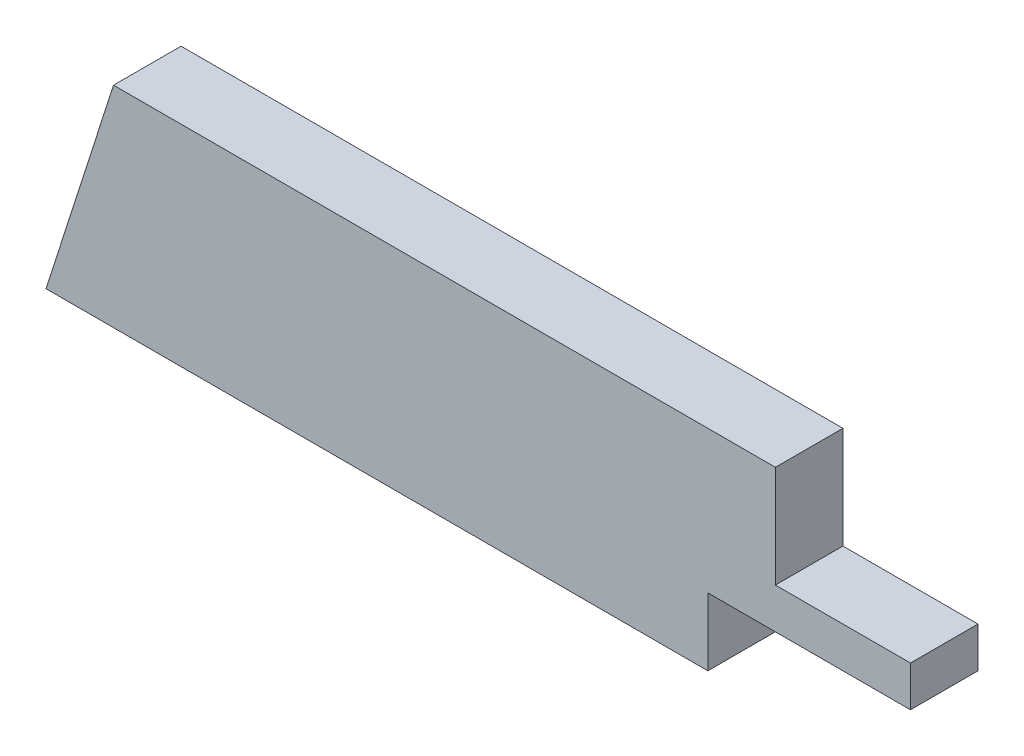
ISO-10303-21;
HEADER;
FILE_DESCRIPTION(('STEP AP214'),'2;1');
FILE_NAME('part.step','',(''),(''),'','','');
FILE_SCHEMA(('AUTOMOTIVE_DESIGN { 1 0 10303 214 1 1 1 1 }'));
ENDSEC;
DATA;
#1=APPLICATION_CONTEXT('core data for automotive mechanical design processes');
#2=APPLICATION_PROTOCOL_DEFINITION('international standard','automotive_design',2000,#1);
#3=PRODUCT_CONTEXT('',#1,'mechanical');
#4=PRODUCT('Part','Part','',(#3));
#5=PRODUCT_RELATED_PRODUCT_CATEGORY('part','',(#4));
#6=PRODUCT_DEFINITION_FORMATION('','',#4);
#7=PRODUCT_DEFINITION_CONTEXT('part definition',#1,'design');
#8=PRODUCT_DEFINITION('design','',#6,#7);
#9=PRODUCT_DEFINITION_SHAPE('','',#8);
#10=(LENGTH_UNIT() NAMED_UNIT(*) SI_UNIT(.MILLI.,.METRE.));
#11=(NAMED_UNIT(*) PLANE_ANGLE_UNIT() SI_UNIT($,.RADIAN.));
#12=(NAMED_UNIT(*) SI_UNIT($,.STERADIAN.) SOLID_ANGLE_UNIT());
#13=UNCERTAINTY_MEASURE_WITH_UNIT(LENGTH_MEASURE(1.E-05),#10,'distance_accuracy_value','');
#14=(GEOMETRIC_REPRESENTATION_CONTEXT(3) GLOBAL_UNCERTAINTY_ASSIGNED_CONTEXT((#13)) GLOBAL_UNIT_ASSIGNED_CONTEXT((#10,
#11,#12)) REPRESENTATION_CONTEXT('',''));
#15=CARTESIAN_POINT('',(0.,0.,0.));
#16=DIRECTION('',(0.,0.,1.));
#17=DIRECTION('',(1.,0.,0.));
#18=AXIS2_PLACEMENT_3D('',#15,#16,#17);
#19=CARTESIAN_POINT('',(0.,0.,5.));
#20=DIRECTION('',(-1.,0.,0.));
#21=DIRECTION('',(0.,-1.,0.));
#22=AXIS2_PLACEMENT_3D('',#19,#20,#21);
#23=PLANE('',#22);
#24=DIRECTION('',(0.,1.,0.));
#25=VECTOR('',#24,1.);
#26=CARTESIAN_POINT('',(0.,0.,0.));
#27=LINE('',#26,#25);
#28=CARTESIAN_POINT('',(0.,-7.55,0.));
#29=VERTEX_POINT('',#28);
#30=CARTESIAN_POINT('',(0.,0.,0.));
#31=VERTEX_POINT('',#30);
#32=EDGE_CURVE('E140',#29,#31,#27,.T.);
#33=ORIENTED_EDGE('',*,*,#32,.T.);
#34=DIRECTION('',(0.,0.,-1.));
#35=VECTOR('',#34,1.);
#36=CARTESIAN_POINT('',(0.,0.,5.));
#37=LINE('',#36,#35);
#38=CARTESIAN_POINT('',(0.,0.,5.));
#39=VERTEX_POINT('',#38);
#40=EDGE_CURVE('E11',#39,#31,#37,.T.);
#41=ORIENTED_EDGE('',*,*,#40,.F.);
#42=DIRECTION('',(0.,1.,0.));
#43=VECTOR('',#42,1.);
#44=CARTESIAN_POINT('',(0.,0.,5.));
#45=LINE('',#44,#43);
#46=CARTESIAN_POINT('',(0.,-7.55,5.));
#47=VERTEX_POINT('',#46);
#48=EDGE_CURVE('E163',#47,#39,#45,.T.);
#49=ORIENTED_EDGE('',*,*,#48,.F.);
#50=DIRECTION('',(0.,0.,-1.));
#51=VECTOR('',#50,1.);
#52=CARTESIAN_POINT('',(0.,-7.55,5.));
#53=LINE('',#52,#51);
#54=EDGE_CURVE('E136',#47,#29,#53,.T.);
#55=ORIENTED_EDGE('',*,*,#54,.T.);
#56=EDGE_LOOP('',(#33,#41,#49,#55));
#57=FACE_BOUND('',#56,.T.);
#58=ADVANCED_FACE('F38',(#57),#23,.F.);
#59=CARTESIAN_POINT('',(-49.,0.,5.));
#60=DIRECTION('',(0.,-1.,0.));
#61=DIRECTION('',(0.,0.,-1.));
#62=AXIS2_PLACEMENT_3D('',#59,#60,#61);
#63=PLANE('',#62);
#64=DIRECTION('',(-1.,0.,0.));
#65=VECTOR('',#64,1.);
#66=CARTESIAN_POINT('',(-49.,0.,0.));
#67=LINE('',#66,#65);
#68=CARTESIAN_POINT('',(-49.,0.,0.));
#69=VERTEX_POINT('',#68);
#70=EDGE_CURVE('E144',#31,#69,#67,.T.);
#71=ORIENTED_EDGE('',*,*,#70,.T.);
#72=DIRECTION('',(0.,0.,-1.));
#73=VECTOR('',#72,1.);
#74=CARTESIAN_POINT('',(-49.,0.,5.));
#75=LINE('',#74,#73);
#76=CARTESIAN_POINT('',(-49.,0.,5.));
#77=VERTEX_POINT('',#76);
#78=EDGE_CURVE('E47',#77,#69,#75,.T.);
#79=ORIENTED_EDGE('',*,*,#78,.F.);
#80=DIRECTION('',(-1.,0.,0.));
#81=VECTOR('',#80,1.);
#82=CARTESIAN_POINT('',(-49.,0.,5.));
#83=LINE('',#82,#81);
#84=EDGE_CURVE('E98',#39,#77,#83,.T.);
#85=ORIENTED_EDGE('',*,*,#84,.F.);
#86=ORIENTED_EDGE('',*,*,#40,.T.);
#87=EDGE_LOOP('',(#71,#79,#85,#86));
#88=FACE_BOUND('',#87,.T.);
#89=ADVANCED_FACE('F212',(#88),#63,.F.);
#90=CARTESIAN_POINT('',(-54.,-15.55,5.));
#91=DIRECTION('',(0.951996706713836,-0.306108265824384,0.));
#92=DIRECTION('',(0.306108265824384,0.951996706713835,0.));
#93=AXIS2_PLACEMENT_3D('',#90,#91,#92);
#94=PLANE('',#93);
#95=DIRECTION('',(-0.306108265824384,-0.951996706713835,0.));
#96=VECTOR('',#95,1.);
#97=CARTESIAN_POINT('',(-54.,-15.55,0.));
#98=LINE('',#97,#96);
#99=CARTESIAN_POINT('',(-54.,-15.55,0.));
#100=VERTEX_POINT('',#99);
#101=EDGE_CURVE('E147',#69,#100,#98,.T.);
#102=ORIENTED_EDGE('',*,*,#101,.T.);
#103=DIRECTION('',(0.,0.,-1.));
#104=VECTOR('',#103,1.);
#105=CARTESIAN_POINT('',(-54.,-15.55,5.));
#106=LINE('',#105,#104);
#107=CARTESIAN_POINT('',(-54.,-15.55,5.));
#108=VERTEX_POINT('',#107);
#109=EDGE_CURVE('E174',#108,#100,#106,.T.);
#110=ORIENTED_EDGE('',*,*,#109,.F.);
#111=DIRECTION('',(-0.306108265824384,-0.951996706713835,0.));
#112=VECTOR('',#111,1.);
#113=CARTESIAN_POINT('',(-54.,-15.55,5.));
#114=LINE('',#113,#112);
#115=EDGE_CURVE('E186',#77,#108,#114,.T.);
#116=ORIENTED_EDGE('',*,*,#115,.F.);
#117=ORIENTED_EDGE('',*,*,#78,.T.);
#118=EDGE_LOOP('',(#102,#110,#116,#117));
#119=FACE_BOUND('',#118,.T.);
#120=ADVANCED_FACE('F184',(#119),#94,.F.);
#121=CARTESIAN_POINT('',(-5.,-15.55,5.));
#122=DIRECTION('',(0.,1.,0.));
#123=DIRECTION('',(-1.,0.,0.));
#124=AXIS2_PLACEMENT_3D('',#121,#122,#123);
#125=PLANE('',#124);
#126=DIRECTION('',(1.,0.,0.));
#127=VECTOR('',#126,1.);
#128=CARTESIAN_POINT('',(-5.,-15.55,0.));
#129=LINE('',#128,#127);
#130=CARTESIAN_POINT('',(-5.,-15.55,0.));
#131=VERTEX_POINT('',#130);
#132=EDGE_CURVE('E150',#100,#131,#129,.T.);
#133=ORIENTED_EDGE('',*,*,#132,.T.);
#134=DIRECTION('',(0.,0.,-1.));
#135=VECTOR('',#134,1.);
#136=CARTESIAN_POINT('',(-5.,-15.55,5.));
#137=LINE('',#136,#135);
#138=CARTESIAN_POINT('',(-5.,-15.55,5.));
#139=VERTEX_POINT('',#138);
#140=EDGE_CURVE('E170',#139,#131,#137,.T.);
#141=ORIENTED_EDGE('',*,*,#140,.F.);
#142=DIRECTION('',(1.,0.,0.));
#143=VECTOR('',#142,1.);
#144=CARTESIAN_POINT('',(-5.,-15.55,5.));
#145=LINE('',#144,#143);
#146=EDGE_CURVE('E199',#108,#139,#145,.T.);
#147=ORIENTED_EDGE('',*,*,#146,.F.);
#148=ORIENTED_EDGE('',*,*,#109,.T.);
#149=EDGE_LOOP('',(#133,#141,#147,#148));
#150=FACE_BOUND('',#149,.T.);
#151=ADVANCED_FACE('F194',(#150),#125,.F.);
#152=CARTESIAN_POINT('',(-5.,-10.55,5.));
#153=DIRECTION('',(-1.,0.,0.));
#154=DIRECTION('',(0.,-1.,0.));
#155=AXIS2_PLACEMENT_3D('',#152,#153,#154);
#156=PLANE('',#155);
#157=DIRECTION('',(0.,1.,0.));
#158=VECTOR('',#157,1.);
#159=CARTESIAN_POINT('',(-5.,-10.55,0.));
#160=LINE('',#159,#158);
#161=CARTESIAN_POINT('',(-5.,-10.55,0.));
#162=VERTEX_POINT('',#161);
#163=EDGE_CURVE('E153',#131,#162,#160,.T.);
#164=ORIENTED_EDGE('',*,*,#163,.T.);
#165=DIRECTION('',(0.,0.,-1.));
#166=VECTOR('',#165,1.);
#167=CARTESIAN_POINT('',(-5.,-10.55,5.));
#168=LINE('',#167,#166);
#169=CARTESIAN_POINT('',(-5.,-10.55,5.));
#170=VERTEX_POINT('',#169);
#171=EDGE_CURVE('E127',#170,#162,#168,.T.);
#172=ORIENTED_EDGE('',*,*,#171,.F.);
#173=DIRECTION('',(0.,1.,0.));
#174=VECTOR('',#173,1.);
#175=CARTESIAN_POINT('',(-5.,-10.55,5.));
#176=LINE('',#175,#174);
#177=EDGE_CURVE('E117',#139,#170,#176,.T.);
#178=ORIENTED_EDGE('',*,*,#177,.F.);
#179=ORIENTED_EDGE('',*,*,#140,.T.);
#180=EDGE_LOOP('',(#164,#172,#178,#179));
#181=FACE_BOUND('',#180,.T.);
#182=ADVANCED_FACE('F197',(#181),#156,.F.);
#183=CARTESIAN_POINT('',(10.,-10.55,5.));
#184=DIRECTION('',(0.,1.,0.));
#185=DIRECTION('',(-1.,0.,0.));
#186=AXIS2_PLACEMENT_3D('',#183,#184,#185);
#187=PLANE('',#186);
#188=DIRECTION('',(1.,0.,0.));
#189=VECTOR('',#188,1.);
#190=CARTESIAN_POINT('',(10.,-10.55,0.));
#191=LINE('',#190,#189);
#192=CARTESIAN_POINT('',(10.,-10.55,0.));
#193=VERTEX_POINT('',#192);
#194=EDGE_CURVE('E125',#162,#193,#191,.T.);
#195=ORIENTED_EDGE('',*,*,#194,.T.);
#196=DIRECTION('',(0.,0.,-1.));
#197=VECTOR('',#196,1.);
#198=CARTESIAN_POINT('',(10.,-10.55,5.));
#199=LINE('',#198,#197);
#200=CARTESIAN_POINT('',(10.,-10.55,5.));
#201=VERTEX_POINT('',#200);
#202=EDGE_CURVE('E123',#201,#193,#199,.T.);
#203=ORIENTED_EDGE('',*,*,#202,.F.);
#204=DIRECTION('',(1.,0.,0.));
#205=VECTOR('',#204,1.);
#206=CARTESIAN_POINT('',(0.,-10.55,5.));
#207=LINE('',#206,#205);
#208=EDGE_CURVE('E111',#170,#201,#207,.T.);
#209=ORIENTED_EDGE('',*,*,#208,.F.);
#210=ORIENTED_EDGE('',*,*,#171,.T.);
#211=EDGE_LOOP('',(#195,#203,#209,#210));
#212=FACE_BOUND('',#211,.T.);
#213=ADVANCED_FACE('F124',(#212),#187,.F.);
#214=CARTESIAN_POINT('',(10.,-7.55,5.));
#215=DIRECTION('',(-1.,0.,0.));
#216=DIRECTION('',(0.,0.,1.));
#217=AXIS2_PLACEMENT_3D('',#214,#215,#216);
#218=PLANE('',#217);
#219=DIRECTION('',(0.,1.,0.));
#220=VECTOR('',#219,1.);
#221=CARTESIAN_POINT('',(10.,-7.55,0.));
#222=LINE('',#221,#220);
#223=CARTESIAN_POINT('',(10.,-7.55,0.));
#224=VERTEX_POINT('',#223);
#225=EDGE_CURVE('E84',#193,#224,#222,.T.);
#226=ORIENTED_EDGE('',*,*,#225,.T.);
#227=DIRECTION('',(0.,0.,-1.));
#228=VECTOR('',#227,1.);
#229=CARTESIAN_POINT('',(10.,-7.55,5.));
#230=LINE('',#229,#228);
#231=CARTESIAN_POINT('',(10.,-7.55,5.));
#232=VERTEX_POINT('',#231);
#233=EDGE_CURVE('E128',#232,#224,#230,.T.);
#234=ORIENTED_EDGE('',*,*,#233,.F.);
#235=DIRECTION('',(0.,1.,0.));
#236=VECTOR('',#235,1.);
#237=CARTESIAN_POINT('',(10.,-7.55,5.));
#238=LINE('',#237,#236);
#239=EDGE_CURVE('E115',#201,#232,#238,.T.);
#240=ORIENTED_EDGE('',*,*,#239,.F.);
#241=ORIENTED_EDGE('',*,*,#202,.T.);
#242=EDGE_LOOP('',(#226,#234,#240,#241));
#243=FACE_BOUND('',#242,.T.);
#244=ADVANCED_FACE('F130',(#243),#218,.F.);
#245=CARTESIAN_POINT('',(0.,-7.55,5.));
#246=DIRECTION('',(0.,-1.,0.));
#247=DIRECTION('',(0.,0.,-1.));
#248=AXIS2_PLACEMENT_3D('',#245,#246,#247);
#249=PLANE('',#248);
#250=DIRECTION('',(-1.,0.,0.));
#251=VECTOR('',#250,1.);
#252=CARTESIAN_POINT('',(0.,-7.55,0.));
#253=LINE('',#252,#251);
#254=EDGE_CURVE('E90',#224,#29,#253,.T.);
#255=ORIENTED_EDGE('',*,*,#254,.T.);
#256=ORIENTED_EDGE('',*,*,#54,.F.);
#257=DIRECTION('',(-1.,0.,0.));
#258=VECTOR('',#257,1.);
#259=CARTESIAN_POINT('',(0.,-7.55,5.));
#260=LINE('',#259,#258);
#261=EDGE_CURVE('E55',#232,#47,#260,.T.);
#262=ORIENTED_EDGE('',*,*,#261,.F.);
#263=ORIENTED_EDGE('',*,*,#233,.T.);
#264=EDGE_LOOP('',(#255,#256,#262,#263));
#265=FACE_BOUND('',#264,.T.);
#266=ADVANCED_FACE('F228',(#265),#249,.F.);
#267=CARTESIAN_POINT('',(0.,0.,5.));
#268=DIRECTION('',(0.,0.,1.));
#269=DIRECTION('',(1.,0.,0.));
#270=AXIS2_PLACEMENT_3D('',#267,#268,#269);
#271=PLANE('',#270);
#272=ORIENTED_EDGE('',*,*,#48,.T.);
#273=ORIENTED_EDGE('',*,*,#84,.T.);
#274=ORIENTED_EDGE('',*,*,#115,.T.);
#275=ORIENTED_EDGE('',*,*,#146,.T.);
#276=ORIENTED_EDGE('',*,*,#177,.T.);
#277=ORIENTED_EDGE('',*,*,#208,.T.);
#278=ORIENTED_EDGE('',*,*,#239,.T.);
#279=ORIENTED_EDGE('',*,*,#261,.T.);
#280=EDGE_LOOP('',(#272,#273,#274,#275,#276,#277,#278,#279));
#281=FACE_BOUND('',#280,.T.);
#282=ADVANCED_FACE('F113',(#281),#271,.T.);
#283=CARTESIAN_POINT('',(0.,0.,0.));
#284=DIRECTION('',(0.,0.,1.));
#285=DIRECTION('',(1.,0.,0.));
#286=AXIS2_PLACEMENT_3D('',#283,#284,#285);
#287=PLANE('',#286);
#288=ORIENTED_EDGE('',*,*,#32,.F.);
#289=ORIENTED_EDGE('',*,*,#254,.F.);
#290=ORIENTED_EDGE('',*,*,#225,.F.);
#291=ORIENTED_EDGE('',*,*,#194,.F.);
#292=ORIENTED_EDGE('',*,*,#163,.F.);
#293=ORIENTED_EDGE('',*,*,#132,.F.);
#294=ORIENTED_EDGE('',*,*,#101,.F.);
#295=ORIENTED_EDGE('',*,*,#70,.F.);
#296=EDGE_LOOP('',(#288,#289,#290,#291,#292,#293,#294,#295));
#297=FACE_BOUND('',#296,.T.);
#298=ADVANCED_FACE('F190',(#297),#287,.F.);
#299=CLOSED_SHELL('',(#58,#89,#120,#151,#182,#213,#244,#266,#282,#298));
#300=MANIFOLD_SOLID_BREP('B2',#299);
#301=ADVANCED_BREP_SHAPE_REPRESENTATION('',(#18,#300),#14);
#302=SHAPE_DEFINITION_REPRESENTATION(#9,#301);
ENDSEC;
END-ISO-10303-21;
